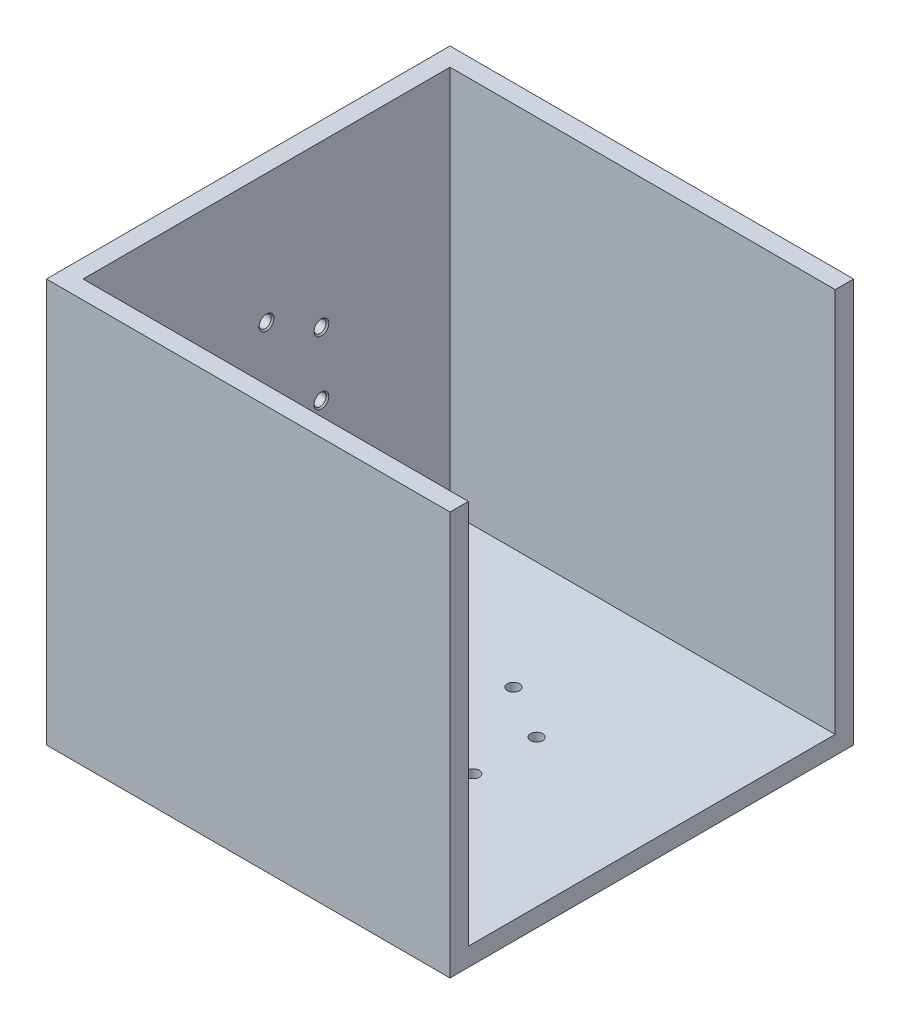
ISO-10303-21;
HEADER;
FILE_DESCRIPTION(('STEP AP214'),'2;1');
FILE_NAME('part.step','',(''),(''),'','','');
FILE_SCHEMA(('AUTOMOTIVE_DESIGN { 1 0 10303 214 1 1 1 1 }'));
ENDSEC;
DATA;
#1=APPLICATION_CONTEXT('core data for automotive mechanical design processes');
#2=APPLICATION_PROTOCOL_DEFINITION('international standard','automotive_design',2000,#1);
#3=PRODUCT_CONTEXT('',#1,'mechanical');
#4=PRODUCT('Part','Part','',(#3));
#5=PRODUCT_RELATED_PRODUCT_CATEGORY('part','',(#4));
#6=PRODUCT_DEFINITION_FORMATION('','',#4);
#7=PRODUCT_DEFINITION_CONTEXT('part definition',#1,'design');
#8=PRODUCT_DEFINITION('design','',#6,#7);
#9=PRODUCT_DEFINITION_SHAPE('','',#8);
#10=(LENGTH_UNIT() NAMED_UNIT(*) SI_UNIT(.MILLI.,.METRE.));
#11=(NAMED_UNIT(*) PLANE_ANGLE_UNIT() SI_UNIT($,.RADIAN.));
#12=(NAMED_UNIT(*) SI_UNIT($,.STERADIAN.) SOLID_ANGLE_UNIT());
#13=UNCERTAINTY_MEASURE_WITH_UNIT(LENGTH_MEASURE(1.E-05),#10,'distance_accuracy_value','');
#14=(GEOMETRIC_REPRESENTATION_CONTEXT(3) GLOBAL_UNCERTAINTY_ASSIGNED_CONTEXT((#13)) GLOBAL_UNIT_ASSIGNED_CONTEXT((#10,
#11,#12)) REPRESENTATION_CONTEXT('',''));
#15=CARTESIAN_POINT('',(0.,0.,0.));
#16=DIRECTION('',(0.,0.,1.));
#17=DIRECTION('',(1.,0.,0.));
#18=AXIS2_PLACEMENT_3D('',#15,#16,#17);
#19=CARTESIAN_POINT('',(55.,110.,-55.));
#20=DIRECTION('',(-1.,0.,0.));
#21=DIRECTION('',(0.,0.,1.));
#22=AXIS2_PLACEMENT_3D('',#19,#20,#21);
#23=PLANE('',#22);
#24=DIRECTION('',(0.,0.,-1.));
#25=VECTOR('',#24,1.);
#26=CARTESIAN_POINT('',(55.,110.,-55.));
#27=LINE('',#26,#25);
#28=CARTESIAN_POINT('',(55.,110.,-50.));
#29=VERTEX_POINT('',#28);
#30=CARTESIAN_POINT('',(55.,110.,-55.));
#31=VERTEX_POINT('',#30);
#32=EDGE_CURVE('E94',#29,#31,#27,.T.);
#33=ORIENTED_EDGE('',*,*,#32,.F.);
#34=DIRECTION('',(0.,-1.,0.));
#35=VECTOR('',#34,1.);
#36=CARTESIAN_POINT('',(55.,110.,-50.));
#37=LINE('',#36,#35);
#38=CARTESIAN_POINT('',(55.,5.,-50.));
#39=VERTEX_POINT('',#38);
#40=EDGE_CURVE('E139',#29,#39,#37,.T.);
#41=ORIENTED_EDGE('',*,*,#40,.T.);
#42=DIRECTION('',(0.,0.,-1.));
#43=VECTOR('',#42,1.);
#44=CARTESIAN_POINT('',(55.,5.,-55.));
#45=LINE('',#44,#43);
#46=CARTESIAN_POINT('',(55.,5.,50.));
#47=VERTEX_POINT('',#46);
#48=EDGE_CURVE('E138',#47,#39,#45,.T.);
#49=ORIENTED_EDGE('',*,*,#48,.F.);
#50=DIRECTION('',(0.,1.,0.));
#51=VECTOR('',#50,1.);
#52=CARTESIAN_POINT('',(55.,110.,50.));
#53=LINE('',#52,#51);
#54=CARTESIAN_POINT('',(55.,110.,50.));
#55=VERTEX_POINT('',#54);
#56=EDGE_CURVE('E125',#47,#55,#53,.T.);
#57=ORIENTED_EDGE('',*,*,#56,.T.);
#58=CARTESIAN_POINT('',(55.,110.,55.));
#59=VERTEX_POINT('',#58);
#60=EDGE_CURVE('E135',#59,#55,#27,.T.);
#61=ORIENTED_EDGE('',*,*,#60,.F.);
#62=DIRECTION('',(0.,-1.,0.));
#63=VECTOR('',#62,1.);
#64=CARTESIAN_POINT('',(55.,110.,55.));
#65=LINE('',#64,#63);
#66=CARTESIAN_POINT('',(55.,0.,55.));
#67=VERTEX_POINT('',#66);
#68=EDGE_CURVE('E152',#59,#67,#65,.T.);
#69=ORIENTED_EDGE('',*,*,#68,.T.);
#70=DIRECTION('',(0.,0.,-1.));
#71=VECTOR('',#70,1.);
#72=CARTESIAN_POINT('',(55.,0.,-55.));
#73=LINE('',#72,#71);
#74=CARTESIAN_POINT('',(55.,0.,-55.));
#75=VERTEX_POINT('',#74);
#76=EDGE_CURVE('E153',#67,#75,#73,.T.);
#77=ORIENTED_EDGE('',*,*,#76,.T.);
#78=DIRECTION('',(0.,-1.,0.));
#79=VECTOR('',#78,1.);
#80=CARTESIAN_POINT('',(55.,110.,-55.));
#81=LINE('',#80,#79);
#82=EDGE_CURVE('E11',#31,#75,#81,.T.);
#83=ORIENTED_EDGE('',*,*,#82,.F.);
#84=EDGE_LOOP('',(#33,#41,#49,#57,#61,#69,#77,#83));
#85=FACE_BOUND('',#84,.T.);
#86=ADVANCED_FACE('F45',(#85),#23,.F.);
#87=CARTESIAN_POINT('',(-55.,110.,-55.));
#88=DIRECTION('',(0.,0.,1.));
#89=DIRECTION('',(1.,0.,0.));
#90=AXIS2_PLACEMENT_3D('',#87,#88,#89);
#91=PLANE('',#90);
#92=DIRECTION('',(-1.,0.,0.));
#93=VECTOR('',#92,1.);
#94=CARTESIAN_POINT('',(-55.,0.,-55.));
#95=LINE('',#94,#93);
#96=CARTESIAN_POINT('',(-55.,0.,-55.));
#97=VERTEX_POINT('',#96);
#98=EDGE_CURVE('E156',#75,#97,#95,.T.);
#99=ORIENTED_EDGE('',*,*,#98,.T.);
#100=DIRECTION('',(0.,-1.,0.));
#101=VECTOR('',#100,1.);
#102=CARTESIAN_POINT('',(-55.,110.,-55.));
#103=LINE('',#102,#101);
#104=CARTESIAN_POINT('',(-55.,110.,-55.));
#105=VERTEX_POINT('',#104);
#106=EDGE_CURVE('E54',#105,#97,#103,.T.);
#107=ORIENTED_EDGE('',*,*,#106,.F.);
#108=DIRECTION('',(-1.,0.,0.));
#109=VECTOR('',#108,1.);
#110=CARTESIAN_POINT('',(-55.,110.,-55.));
#111=LINE('',#110,#109);
#112=EDGE_CURVE('E142',#31,#105,#111,.T.);
#113=ORIENTED_EDGE('',*,*,#112,.F.);
#114=ORIENTED_EDGE('',*,*,#82,.T.);
#115=EDGE_LOOP('',(#99,#107,#113,#114));
#116=FACE_BOUND('',#115,.T.);
#117=ADVANCED_FACE('F234',(#116),#91,.F.);
#118=CARTESIAN_POINT('',(-55.,110.,-55.));
#119=DIRECTION('',(1.,0.,0.));
#120=DIRECTION('',(0.,0.,-1.));
#121=AXIS2_PLACEMENT_3D('',#118,#119,#120);
#122=PLANE('',#121);
#123=CARTESIAN_POINT('',(-55.,66.1144049527634,-14.9572893754042));
#124=DIRECTION('',(1.,0.,0.));
#125=DIRECTION('',(0.,0.,-1.));
#126=AXIS2_PLACEMENT_3D('',#123,#124,#125);
#127=CIRCLE('',#126,1.65);
#128=CARTESIAN_POINT('',(-55.,66.1144049527634,-16.6072893754042));
#129=VERTEX_POINT('',#128);
#130=EDGE_CURVE('E594',#129,#129,#127,.T.);
#131=ORIENTED_EDGE('',*,*,#130,.T.);
#132=EDGE_LOOP('',(#131));
#133=FACE_BOUND('',#132,.T.);
#134=CARTESIAN_POINT('',(-55.,48.8432148582897,-14.9572893754044));
#135=DIRECTION('',(1.,0.,0.));
#136=DIRECTION('',(0.,0.,-1.));
#137=AXIS2_PLACEMENT_3D('',#134,#135,#136);
#138=CIRCLE('',#137,1.65);
#139=CARTESIAN_POINT('',(-55.,48.8432148582897,-16.6072893754043));
#140=VERTEX_POINT('',#139);
#141=EDGE_CURVE('E605',#140,#140,#138,.T.);
#142=ORIENTED_EDGE('',*,*,#141,.T.);
#143=EDGE_LOOP('',(#142));
#144=FACE_BOUND('',#143,.T.);
#145=CARTESIAN_POINT('',(-55.,40.2076198110528,0.));
#146=DIRECTION('',(1.,0.,0.));
#147=DIRECTION('',(0.,0.,-1.));
#148=AXIS2_PLACEMENT_3D('',#145,#146,#147);
#149=CIRCLE('',#148,1.65);
#150=CARTESIAN_POINT('',(-55.,40.2076198110528,-1.64999999999998));
#151=VERTEX_POINT('',#150);
#152=EDGE_CURVE('E614',#151,#151,#149,.T.);
#153=ORIENTED_EDGE('',*,*,#152,.T.);
#154=EDGE_LOOP('',(#153));
#155=FACE_BOUND('',#154,.T.);
#156=CARTESIAN_POINT('',(-55.,48.8432148582895,14.9572893754043));
#157=DIRECTION('',(1.,0.,0.));
#158=DIRECTION('',(0.,0.,-1.));
#159=AXIS2_PLACEMENT_3D('',#156,#157,#158);
#160=CIRCLE('',#159,1.65);
#161=CARTESIAN_POINT('',(-55.,48.8432148582895,13.3072893754043));
#162=VERTEX_POINT('',#161);
#163=EDGE_CURVE('E623',#162,#162,#160,.T.);
#164=ORIENTED_EDGE('',*,*,#163,.T.);
#165=EDGE_LOOP('',(#164));
#166=FACE_BOUND('',#165,.T.);
#167=CARTESIAN_POINT('',(-55.,66.1144049527632,14.9572893754043));
#168=DIRECTION('',(1.,0.,0.));
#169=DIRECTION('',(0.,0.,-1.));
#170=AXIS2_PLACEMENT_3D('',#167,#168,#169);
#171=CIRCLE('',#170,1.65);
#172=CARTESIAN_POINT('',(-55.,66.1144049527632,13.3072893754043));
#173=VERTEX_POINT('',#172);
#174=EDGE_CURVE('E632',#173,#173,#171,.T.);
#175=ORIENTED_EDGE('',*,*,#174,.T.);
#176=EDGE_LOOP('',(#175));
#177=FACE_BOUND('',#176,.T.);
#178=CARTESIAN_POINT('',(-55.,74.75,0.));
#179=DIRECTION('',(1.,0.,0.));
#180=DIRECTION('',(0.,0.,-1.));
#181=AXIS2_PLACEMENT_3D('',#178,#179,#180);
#182=CIRCLE('',#181,1.65);
#183=CARTESIAN_POINT('',(-55.,74.75,-1.64999999999999));
#184=VERTEX_POINT('',#183);
#185=EDGE_CURVE('E641',#184,#184,#182,.T.);
#186=ORIENTED_EDGE('',*,*,#185,.T.);
#187=EDGE_LOOP('',(#186));
#188=FACE_BOUND('',#187,.T.);
#189=DIRECTION('',(0.,0.,1.));
#190=VECTOR('',#189,1.);
#191=CARTESIAN_POINT('',(-55.,0.,-55.));
#192=LINE('',#191,#190);
#193=CARTESIAN_POINT('',(-55.,0.,55.));
#194=VERTEX_POINT('',#193);
#195=EDGE_CURVE('E81',#97,#194,#192,.T.);
#196=ORIENTED_EDGE('',*,*,#195,.T.);
#197=DIRECTION('',(0.,-1.,0.));
#198=VECTOR('',#197,1.);
#199=CARTESIAN_POINT('',(-55.,110.,55.));
#200=LINE('',#199,#198);
#201=CARTESIAN_POINT('',(-55.,110.,55.));
#202=VERTEX_POINT('',#201);
#203=EDGE_CURVE('E161',#202,#194,#200,.T.);
#204=ORIENTED_EDGE('',*,*,#203,.F.);
#205=DIRECTION('',(0.,0.,1.));
#206=VECTOR('',#205,1.);
#207=CARTESIAN_POINT('',(-55.,110.,-55.));
#208=LINE('',#207,#206);
#209=EDGE_CURVE('E144',#105,#202,#208,.T.);
#210=ORIENTED_EDGE('',*,*,#209,.F.);
#211=ORIENTED_EDGE('',*,*,#106,.T.);
#212=EDGE_LOOP('',(#196,#204,#210,#211));
#213=FACE_BOUND('',#212,.T.);
#214=ADVANCED_FACE('F237',(#133,#144,#155,#166,#177,#188,#213),#122,.F.);
#215=CARTESIAN_POINT('',(-55.,110.,55.));
#216=DIRECTION('',(0.,0.,-1.));
#217=DIRECTION('',(-1.,0.,0.));
#218=AXIS2_PLACEMENT_3D('',#215,#216,#217);
#219=PLANE('',#218);
#220=DIRECTION('',(1.,0.,0.));
#221=VECTOR('',#220,1.);
#222=CARTESIAN_POINT('',(-55.,0.,55.));
#223=LINE('',#222,#221);
#224=EDGE_CURVE('E87',#194,#67,#223,.T.);
#225=ORIENTED_EDGE('',*,*,#224,.T.);
#226=ORIENTED_EDGE('',*,*,#68,.F.);
#227=DIRECTION('',(1.,0.,0.));
#228=VECTOR('',#227,1.);
#229=CARTESIAN_POINT('',(-55.,110.,55.));
#230=LINE('',#229,#228);
#231=EDGE_CURVE('E63',#202,#59,#230,.T.);
#232=ORIENTED_EDGE('',*,*,#231,.F.);
#233=ORIENTED_EDGE('',*,*,#203,.T.);
#234=EDGE_LOOP('',(#225,#226,#232,#233));
#235=FACE_BOUND('',#234,.T.);
#236=ADVANCED_FACE('F238',(#235),#219,.F.);
#237=CARTESIAN_POINT('',(0.,110.,0.));
#238=DIRECTION('',(0.,1.,0.));
#239=DIRECTION('',(0.,0.,1.));
#240=AXIS2_PLACEMENT_3D('',#237,#238,#239);
#241=PLANE('',#240);
#242=DIRECTION('',(-1.,0.,0.));
#243=VECTOR('',#242,1.);
#244=CARTESIAN_POINT('',(-50.,110.,-50.));
#245=LINE('',#244,#243);
#246=CARTESIAN_POINT('',(-50.,110.,-50.));
#247=VERTEX_POINT('',#246);
#248=EDGE_CURVE('E215',#29,#247,#245,.T.);
#249=ORIENTED_EDGE('',*,*,#248,.F.);
#250=ORIENTED_EDGE('',*,*,#32,.T.);
#251=ORIENTED_EDGE('',*,*,#112,.T.);
#252=ORIENTED_EDGE('',*,*,#209,.T.);
#253=ORIENTED_EDGE('',*,*,#231,.T.);
#254=ORIENTED_EDGE('',*,*,#60,.T.);
#255=DIRECTION('',(1.,0.,0.));
#256=VECTOR('',#255,1.);
#257=CARTESIAN_POINT('',(-50.,110.,50.));
#258=LINE('',#257,#256);
#259=CARTESIAN_POINT('',(-50.,110.,50.));
#260=VERTEX_POINT('',#259);
#261=EDGE_CURVE('E121',#260,#55,#258,.T.);
#262=ORIENTED_EDGE('',*,*,#261,.F.);
#263=DIRECTION('',(0.,0.,1.));
#264=VECTOR('',#263,1.);
#265=CARTESIAN_POINT('',(-50.,110.,-50.));
#266=LINE('',#265,#264);
#267=EDGE_CURVE('E131',#247,#260,#266,.T.);
#268=ORIENTED_EDGE('',*,*,#267,.F.);
#269=EDGE_LOOP('',(#249,#250,#251,#252,#253,#254,#262,#268));
#270=FACE_BOUND('',#269,.T.);
#271=ADVANCED_FACE('F141',(#270),#241,.T.);
#272=CARTESIAN_POINT('',(0.,0.,0.));
#273=DIRECTION('',(0.,1.,0.));
#274=DIRECTION('',(0.,0.,1.));
#275=AXIS2_PLACEMENT_3D('',#272,#273,#274);
#276=PLANE('',#275);
#277=CARTESIAN_POINT('',(14.9548601894398,0.,8.6158074439338));
#278=DIRECTION('',(0.,-1.,0.));
#279=DIRECTION('',(0.,0.,-1.));
#280=AXIS2_PLACEMENT_3D('',#277,#278,#279);
#281=CIRCLE('',#280,2.025);
#282=CARTESIAN_POINT('',(14.9548601894398,0.,6.5908074439338));
#283=VERTEX_POINT('',#282);
#284=EDGE_CURVE('E644',#283,#283,#281,.T.);
#285=ORIENTED_EDGE('',*,*,#284,.F.);
#286=EDGE_LOOP('',(#285));
#287=FACE_BOUND('',#286,.T.);
#288=CARTESIAN_POINT('',(14.95486018944,0.,-8.65257766819897));
#289=DIRECTION('',(0.,-1.,0.));
#290=DIRECTION('',(0.,0.,-1.));
#291=AXIS2_PLACEMENT_3D('',#288,#289,#290);
#292=CIRCLE('',#291,2.025);
#293=CARTESIAN_POINT('',(14.95486018944,0.,-10.677577668199));
#294=VERTEX_POINT('',#293);
#295=EDGE_CURVE('E191',#294,#294,#292,.T.);
#296=ORIENTED_EDGE('',*,*,#295,.F.);
#297=EDGE_LOOP('',(#296));
#298=FACE_BOUND('',#297,.T.);
#299=CARTESIAN_POINT('',(0.,0.,-17.2867702242655));
#300=DIRECTION('',(0.,-1.,0.));
#301=DIRECTION('',(0.,0.,-1.));
#302=AXIS2_PLACEMENT_3D('',#299,#300,#301);
#303=CIRCLE('',#302,2.025);
#304=CARTESIAN_POINT('',(0.,0.,-19.3117702242655));
#305=VERTEX_POINT('',#304);
#306=EDGE_CURVE('E184',#305,#305,#303,.T.);
#307=ORIENTED_EDGE('',*,*,#306,.F.);
#308=EDGE_LOOP('',(#307));
#309=FACE_BOUND('',#308,.T.);
#310=CARTESIAN_POINT('',(-14.9548601894399,0.,-8.65257766819919));
#311=DIRECTION('',(0.,-1.,0.));
#312=DIRECTION('',(0.,0.,-1.));
#313=AXIS2_PLACEMENT_3D('',#310,#311,#312);
#314=CIRCLE('',#313,2.025);
#315=CARTESIAN_POINT('',(-14.9548601894399,0.,-10.6775776681992));
#316=VERTEX_POINT('',#315);
#317=EDGE_CURVE('E180',#316,#316,#314,.T.);
#318=ORIENTED_EDGE('',*,*,#317,.F.);
#319=EDGE_LOOP('',(#318));
#320=FACE_BOUND('',#319,.T.);
#321=CARTESIAN_POINT('',(-14.95486018944,0.,8.61580744393359));
#322=DIRECTION('',(0.,-1.,0.));
#323=DIRECTION('',(0.,0.,-1.));
#324=AXIS2_PLACEMENT_3D('',#321,#322,#323);
#325=CIRCLE('',#324,2.025);
#326=CARTESIAN_POINT('',(-14.95486018944,0.,6.59080744393359));
#327=VERTEX_POINT('',#326);
#328=EDGE_CURVE('E176',#327,#327,#325,.T.);
#329=ORIENTED_EDGE('',*,*,#328,.F.);
#330=EDGE_LOOP('',(#329));
#331=FACE_BOUND('',#330,.T.);
#332=CARTESIAN_POINT('',(0.,0.,17.25));
#333=DIRECTION('',(0.,-1.,0.));
#334=DIRECTION('',(0.,0.,-1.));
#335=AXIS2_PLACEMENT_3D('',#332,#333,#334);
#336=CIRCLE('',#335,2.025);
#337=CARTESIAN_POINT('',(0.,0.,15.225));
#338=VERTEX_POINT('',#337);
#339=EDGE_CURVE('E171',#338,#338,#336,.T.);
#340=ORIENTED_EDGE('',*,*,#339,.F.);
#341=EDGE_LOOP('',(#340));
#342=FACE_BOUND('',#341,.T.);
#343=ORIENTED_EDGE('',*,*,#76,.F.);
#344=ORIENTED_EDGE('',*,*,#224,.F.);
#345=ORIENTED_EDGE('',*,*,#195,.F.);
#346=ORIENTED_EDGE('',*,*,#98,.F.);
#347=EDGE_LOOP('',(#343,#344,#345,#346));
#348=FACE_BOUND('',#347,.T.);
#349=ADVANCED_FACE('F240',(#287,#298,#309,#320,#331,#342,#348),#276,.F.);
#350=CARTESIAN_POINT('',(-50.,5.,50.));
#351=DIRECTION('',(0.,0.,1.));
#352=DIRECTION('',(1.,0.,0.));
#353=AXIS2_PLACEMENT_3D('',#350,#351,#352);
#354=PLANE('',#353);
#355=ORIENTED_EDGE('',*,*,#261,.T.);
#356=ORIENTED_EDGE('',*,*,#56,.F.);
#357=DIRECTION('',(1.,0.,0.));
#358=VECTOR('',#357,1.);
#359=CARTESIAN_POINT('',(-50.,5.,50.));
#360=LINE('',#359,#358);
#361=CARTESIAN_POINT('',(-50.,5.,50.));
#362=VERTEX_POINT('',#361);
#363=EDGE_CURVE('E221',#362,#47,#360,.T.);
#364=ORIENTED_EDGE('',*,*,#363,.F.);
#365=DIRECTION('',(0.,1.,0.));
#366=VECTOR('',#365,1.);
#367=CARTESIAN_POINT('',(-50.,5.,50.));
#368=LINE('',#367,#366);
#369=EDGE_CURVE('E127',#362,#260,#368,.T.);
#370=ORIENTED_EDGE('',*,*,#369,.T.);
#371=EDGE_LOOP('',(#355,#356,#364,#370));
#372=FACE_BOUND('',#371,.T.);
#373=ADVANCED_FACE('F123',(#372),#354,.F.);
#374=CARTESIAN_POINT('',(-50.,5.,-50.));
#375=DIRECTION('',(-1.,0.,0.));
#376=DIRECTION('',(0.,0.,1.));
#377=AXIS2_PLACEMENT_3D('',#374,#375,#376);
#378=PLANE('',#377);
#379=CARTESIAN_POINT('',(-50.,66.1144049527634,-14.9572893754042));
#380=DIRECTION('',(1.,0.,0.));
#381=DIRECTION('',(0.,0.,-1.));
#382=AXIS2_PLACEMENT_3D('',#379,#380,#381);
#383=CIRCLE('',#382,2.025);
#384=CARTESIAN_POINT('',(-50.,66.1144049527634,-16.9822893754042));
#385=VERTEX_POINT('',#384);
#386=EDGE_CURVE('E592',#385,#385,#383,.T.);
#387=ORIENTED_EDGE('',*,*,#386,.F.);
#388=EDGE_LOOP('',(#387));
#389=FACE_BOUND('',#388,.T.);
#390=CARTESIAN_POINT('',(-50.,48.8432148582897,-14.9572893754044));
#391=DIRECTION('',(1.,0.,0.));
#392=DIRECTION('',(0.,0.,-1.));
#393=AXIS2_PLACEMENT_3D('',#390,#391,#392);
#394=CIRCLE('',#393,2.025);
#395=CARTESIAN_POINT('',(-50.,48.8432148582897,-16.9822893754044));
#396=VERTEX_POINT('',#395);
#397=EDGE_CURVE('E599',#396,#396,#394,.T.);
#398=ORIENTED_EDGE('',*,*,#397,.F.);
#399=EDGE_LOOP('',(#398));
#400=FACE_BOUND('',#399,.T.);
#401=CARTESIAN_POINT('',(-50.,40.2076198110528,0.));
#402=DIRECTION('',(1.,0.,0.));
#403=DIRECTION('',(0.,0.,-1.));
#404=AXIS2_PLACEMENT_3D('',#401,#402,#403);
#405=CIRCLE('',#404,2.025);
#406=CARTESIAN_POINT('',(-50.,40.2076198110528,-2.02499999999999));
#407=VERTEX_POINT('',#406);
#408=EDGE_CURVE('E608',#407,#407,#405,.T.);
#409=ORIENTED_EDGE('',*,*,#408,.F.);
#410=EDGE_LOOP('',(#409));
#411=FACE_BOUND('',#410,.T.);
#412=CARTESIAN_POINT('',(-50.,48.8432148582895,14.9572893754043));
#413=DIRECTION('',(1.,0.,0.));
#414=DIRECTION('',(0.,0.,-1.));
#415=AXIS2_PLACEMENT_3D('',#412,#413,#414);
#416=CIRCLE('',#415,2.025);
#417=CARTESIAN_POINT('',(-50.,48.8432148582895,12.9322893754043));
#418=VERTEX_POINT('',#417);
#419=EDGE_CURVE('E617',#418,#418,#416,.T.);
#420=ORIENTED_EDGE('',*,*,#419,.F.);
#421=EDGE_LOOP('',(#420));
#422=FACE_BOUND('',#421,.T.);
#423=CARTESIAN_POINT('',(-50.,66.1144049527632,14.9572893754043));
#424=DIRECTION('',(1.,0.,0.));
#425=DIRECTION('',(0.,0.,-1.));
#426=AXIS2_PLACEMENT_3D('',#423,#424,#425);
#427=CIRCLE('',#426,2.025);
#428=CARTESIAN_POINT('',(-50.,66.1144049527632,12.9322893754043));
#429=VERTEX_POINT('',#428);
#430=EDGE_CURVE('E626',#429,#429,#427,.T.);
#431=ORIENTED_EDGE('',*,*,#430,.F.);
#432=EDGE_LOOP('',(#431));
#433=FACE_BOUND('',#432,.T.);
#434=CARTESIAN_POINT('',(-50.,74.75,0.));
#435=DIRECTION('',(1.,0.,0.));
#436=DIRECTION('',(0.,0.,-1.));
#437=AXIS2_PLACEMENT_3D('',#434,#435,#436);
#438=CIRCLE('',#437,2.025);
#439=CARTESIAN_POINT('',(-50.,74.75,-2.02499999999999));
#440=VERTEX_POINT('',#439);
#441=EDGE_CURVE('E635',#440,#440,#438,.T.);
#442=ORIENTED_EDGE('',*,*,#441,.F.);
#443=EDGE_LOOP('',(#442));
#444=FACE_BOUND('',#443,.T.);
#445=ORIENTED_EDGE('',*,*,#267,.T.);
#446=ORIENTED_EDGE('',*,*,#369,.F.);
#447=DIRECTION('',(0.,0.,1.));
#448=VECTOR('',#447,1.);
#449=CARTESIAN_POINT('',(-50.,5.,-50.));
#450=LINE('',#449,#448);
#451=CARTESIAN_POINT('',(-50.,5.,-50.));
#452=VERTEX_POINT('',#451);
#453=EDGE_CURVE('E218',#452,#362,#450,.T.);
#454=ORIENTED_EDGE('',*,*,#453,.F.);
#455=DIRECTION('',(0.,1.,0.));
#456=VECTOR('',#455,1.);
#457=CARTESIAN_POINT('',(-50.,5.,-50.));
#458=LINE('',#457,#456);
#459=EDGE_CURVE('E147',#452,#247,#458,.T.);
#460=ORIENTED_EDGE('',*,*,#459,.T.);
#461=EDGE_LOOP('',(#445,#446,#454,#460));
#462=FACE_BOUND('',#461,.T.);
#463=ADVANCED_FACE('F227',(#389,#400,#411,#422,#433,#444,#462),#378,.F.);
#464=CARTESIAN_POINT('',(-50.,5.,-50.));
#465=DIRECTION('',(0.,0.,-1.));
#466=DIRECTION('',(-1.,0.,0.));
#467=AXIS2_PLACEMENT_3D('',#464,#465,#466);
#468=PLANE('',#467);
#469=ORIENTED_EDGE('',*,*,#248,.T.);
#470=ORIENTED_EDGE('',*,*,#459,.F.);
#471=DIRECTION('',(-1.,0.,0.));
#472=VECTOR('',#471,1.);
#473=CARTESIAN_POINT('',(-50.,5.,-50.));
#474=LINE('',#473,#472);
#475=EDGE_CURVE('E130',#39,#452,#474,.T.);
#476=ORIENTED_EDGE('',*,*,#475,.F.);
#477=ORIENTED_EDGE('',*,*,#40,.F.);
#478=EDGE_LOOP('',(#469,#470,#476,#477));
#479=FACE_BOUND('',#478,.T.);
#480=ADVANCED_FACE('F230',(#479),#468,.F.);
#481=CARTESIAN_POINT('',(0.,5.,0.));
#482=DIRECTION('',(0.,1.,0.));
#483=DIRECTION('',(0.,0.,1.));
#484=AXIS2_PLACEMENT_3D('',#481,#482,#483);
#485=PLANE('',#484);
#486=CARTESIAN_POINT('',(14.9548601894398,5.,8.6158074439338));
#487=DIRECTION('',(0.,1.,0.));
#488=DIRECTION('',(0.,0.,1.));
#489=AXIS2_PLACEMENT_3D('',#486,#487,#488);
#490=CIRCLE('',#489,1.64999999999999);
#491=CARTESIAN_POINT('',(14.9548601894398,5.,10.2658074439338));
#492=VERTEX_POINT('',#491);
#493=EDGE_CURVE('E48',#492,#492,#490,.T.);
#494=ORIENTED_EDGE('',*,*,#493,.F.);
#495=EDGE_LOOP('',(#494));
#496=FACE_BOUND('',#495,.T.);
#497=CARTESIAN_POINT('',(14.95486018944,5.,-8.65257766819897));
#498=DIRECTION('',(0.,1.,0.));
#499=DIRECTION('',(0.,0.,1.));
#500=AXIS2_PLACEMENT_3D('',#497,#498,#499);
#501=CIRCLE('',#500,1.64999999999999);
#502=CARTESIAN_POINT('',(14.95486018944,5.,-7.00257766819899));
#503=VERTEX_POINT('',#502);
#504=EDGE_CURVE('E182',#503,#503,#501,.T.);
#505=ORIENTED_EDGE('',*,*,#504,.F.);
#506=EDGE_LOOP('',(#505));
#507=FACE_BOUND('',#506,.T.);
#508=CARTESIAN_POINT('',(0.,5.,-17.2867702242655));
#509=DIRECTION('',(0.,1.,0.));
#510=DIRECTION('',(0.,0.,1.));
#511=AXIS2_PLACEMENT_3D('',#508,#509,#510);
#512=CIRCLE('',#511,1.64999999999999);
#513=CARTESIAN_POINT('',(0.,5.,-15.6367702242655));
#514=VERTEX_POINT('',#513);
#515=EDGE_CURVE('E178',#514,#514,#512,.T.);
#516=ORIENTED_EDGE('',*,*,#515,.F.);
#517=EDGE_LOOP('',(#516));
#518=FACE_BOUND('',#517,.T.);
#519=CARTESIAN_POINT('',(-14.9548601894399,5.,-8.65257766819919));
#520=DIRECTION('',(0.,1.,0.));
#521=DIRECTION('',(0.,0.,1.));
#522=AXIS2_PLACEMENT_3D('',#519,#520,#521);
#523=CIRCLE('',#522,1.64999999999999);
#524=CARTESIAN_POINT('',(-14.9548601894399,5.,-7.0025776681992));
#525=VERTEX_POINT('',#524);
#526=EDGE_CURVE('E173',#525,#525,#523,.T.);
#527=ORIENTED_EDGE('',*,*,#526,.F.);
#528=EDGE_LOOP('',(#527));
#529=FACE_BOUND('',#528,.T.);
#530=CARTESIAN_POINT('',(-14.95486018944,5.,8.61580744393359));
#531=DIRECTION('',(0.,1.,0.));
#532=DIRECTION('',(0.,0.,1.));
#533=AXIS2_PLACEMENT_3D('',#530,#531,#532);
#534=CIRCLE('',#533,1.64999999999999);
#535=CARTESIAN_POINT('',(-14.95486018944,5.,10.2658074439336));
#536=VERTEX_POINT('',#535);
#537=EDGE_CURVE('E168',#536,#536,#534,.T.);
#538=ORIENTED_EDGE('',*,*,#537,.F.);
#539=EDGE_LOOP('',(#538));
#540=FACE_BOUND('',#539,.T.);
#541=CARTESIAN_POINT('',(0.,5.,17.25));
#542=DIRECTION('',(0.,1.,0.));
#543=DIRECTION('',(0.,0.,1.));
#544=AXIS2_PLACEMENT_3D('',#541,#542,#543);
#545=CIRCLE('',#544,1.64999999999999);
#546=CARTESIAN_POINT('',(0.,5.,18.9));
#547=VERTEX_POINT('',#546);
#548=EDGE_CURVE('E164',#547,#547,#545,.T.);
#549=ORIENTED_EDGE('',*,*,#548,.F.);
#550=EDGE_LOOP('',(#549));
#551=FACE_BOUND('',#550,.T.);
#552=ORIENTED_EDGE('',*,*,#363,.T.);
#553=ORIENTED_EDGE('',*,*,#48,.T.);
#554=ORIENTED_EDGE('',*,*,#475,.T.);
#555=ORIENTED_EDGE('',*,*,#453,.T.);
#556=EDGE_LOOP('',(#552,#553,#554,#555));
#557=FACE_BOUND('',#556,.T.);
#558=ADVANCED_FACE('F310',(#496,#507,#518,#529,#540,#551,#557),#485,.T.);
#559=CARTESIAN_POINT('',(0.,0.,17.25));
#560=DIRECTION('',(0.,-1.,0.));
#561=DIRECTION('',(0.,0.,-1.));
#562=AXIS2_PLACEMENT_3D('',#559,#560,#561);
#563=CYLINDRICAL_SURFACE('',#562,1.64999999999999);
#564=ORIENTED_EDGE('',*,*,#548,.T.);
#565=EDGE_LOOP('',(#564));
#566=FACE_BOUND('',#565,.T.);
#567=CARTESIAN_POINT('',(0.,0.375,17.25));
#568=DIRECTION('',(0.,-1.,0.));
#569=DIRECTION('',(0.,0.,-1.));
#570=AXIS2_PLACEMENT_3D('',#567,#568,#569);
#571=CIRCLE('',#570,1.64999999999999);
#572=CARTESIAN_POINT('',(0.,0.375,15.6));
#573=VERTEX_POINT('',#572);
#574=EDGE_CURVE('E167',#573,#573,#571,.T.);
#575=ORIENTED_EDGE('',*,*,#574,.T.);
#576=EDGE_LOOP('',(#575));
#577=FACE_BOUND('',#576,.T.);
#578=ADVANCED_FACE('F319',(#566,#577),#563,.F.);
#579=CARTESIAN_POINT('',(0.,0.,17.25));
#580=DIRECTION('',(0.,-1.,0.));
#581=DIRECTION('',(0.,0.,-1.));
#582=AXIS2_PLACEMENT_3D('',#579,#580,#581);
#583=CONICAL_SURFACE('',#582,2.025,0.78539816339746);
#584=ORIENTED_EDGE('',*,*,#574,.F.);
#585=EDGE_LOOP('',(#584));
#586=FACE_BOUND('',#585,.T.);
#587=ORIENTED_EDGE('',*,*,#339,.T.);
#588=EDGE_LOOP('',(#587));
#589=FACE_BOUND('',#588,.T.);
#590=ADVANCED_FACE('F334',(#586,#589),#583,.F.);
#591=CARTESIAN_POINT('',(-14.95486018944,0.,8.61580744393359));
#592=DIRECTION('',(0.,-1.,0.));
#593=DIRECTION('',(0.,0.,-1.));
#594=AXIS2_PLACEMENT_3D('',#591,#592,#593);
#595=CYLINDRICAL_SURFACE('',#594,1.64999999999999);
#596=ORIENTED_EDGE('',*,*,#537,.T.);
#597=EDGE_LOOP('',(#596));
#598=FACE_BOUND('',#597,.T.);
#599=CARTESIAN_POINT('',(-14.95486018944,0.375,8.61580744393359));
#600=DIRECTION('',(0.,-1.,0.));
#601=DIRECTION('',(0.,0.,-1.));
#602=AXIS2_PLACEMENT_3D('',#599,#600,#601);
#603=CIRCLE('',#602,1.64999999999999);
#604=CARTESIAN_POINT('',(-14.95486018944,0.375,6.9658074439336));
#605=VERTEX_POINT('',#604);
#606=EDGE_CURVE('E172',#605,#605,#603,.T.);
#607=ORIENTED_EDGE('',*,*,#606,.T.);
#608=EDGE_LOOP('',(#607));
#609=FACE_BOUND('',#608,.T.);
#610=ADVANCED_FACE('F344',(#598,#609),#595,.F.);
#611=CARTESIAN_POINT('',(-14.95486018944,0.,8.61580744393359));
#612=DIRECTION('',(0.,-1.,0.));
#613=DIRECTION('',(0.,0.,-1.));
#614=AXIS2_PLACEMENT_3D('',#611,#612,#613);
#615=CONICAL_SURFACE('',#614,2.025,0.78539816339746);
#616=ORIENTED_EDGE('',*,*,#606,.F.);
#617=EDGE_LOOP('',(#616));
#618=FACE_BOUND('',#617,.T.);
#619=ORIENTED_EDGE('',*,*,#328,.T.);
#620=EDGE_LOOP('',(#619));
#621=FACE_BOUND('',#620,.T.);
#622=ADVANCED_FACE('F354',(#618,#621),#615,.F.);
#623=CARTESIAN_POINT('',(-14.9548601894399,0.,-8.65257766819919));
#624=DIRECTION('',(0.,-1.,0.));
#625=DIRECTION('',(0.,0.,-1.));
#626=AXIS2_PLACEMENT_3D('',#623,#624,#625);
#627=CYLINDRICAL_SURFACE('',#626,1.64999999999999);
#628=ORIENTED_EDGE('',*,*,#526,.T.);
#629=EDGE_LOOP('',(#628));
#630=FACE_BOUND('',#629,.T.);
#631=CARTESIAN_POINT('',(-14.9548601894399,0.375,-8.65257766819919));
#632=DIRECTION('',(0.,-1.,0.));
#633=DIRECTION('',(0.,0.,-1.));
#634=AXIS2_PLACEMENT_3D('',#631,#632,#633);
#635=CIRCLE('',#634,1.64999999999999);
#636=CARTESIAN_POINT('',(-14.9548601894399,0.375,-10.3025776681992));
#637=VERTEX_POINT('',#636);
#638=EDGE_CURVE('E177',#637,#637,#635,.T.);
#639=ORIENTED_EDGE('',*,*,#638,.T.);
#640=EDGE_LOOP('',(#639));
#641=FACE_BOUND('',#640,.T.);
#642=ADVANCED_FACE('F365',(#630,#641),#627,.F.);
#643=CARTESIAN_POINT('',(-14.9548601894399,0.,-8.65257766819919));
#644=DIRECTION('',(0.,-1.,0.));
#645=DIRECTION('',(0.,0.,-1.));
#646=AXIS2_PLACEMENT_3D('',#643,#644,#645);
#647=CONICAL_SURFACE('',#646,2.025,0.78539816339746);
#648=ORIENTED_EDGE('',*,*,#638,.F.);
#649=EDGE_LOOP('',(#648));
#650=FACE_BOUND('',#649,.T.);
#651=ORIENTED_EDGE('',*,*,#317,.T.);
#652=EDGE_LOOP('',(#651));
#653=FACE_BOUND('',#652,.T.);
#654=ADVANCED_FACE('F376',(#650,#653),#647,.F.);
#655=CARTESIAN_POINT('',(0.,0.,-17.2867702242655));
#656=DIRECTION('',(0.,-1.,0.));
#657=DIRECTION('',(0.,0.,-1.));
#658=AXIS2_PLACEMENT_3D('',#655,#656,#657);
#659=CYLINDRICAL_SURFACE('',#658,1.64999999999999);
#660=ORIENTED_EDGE('',*,*,#515,.T.);
#661=EDGE_LOOP('',(#660));
#662=FACE_BOUND('',#661,.T.);
#663=CARTESIAN_POINT('',(0.,0.375,-17.2867702242655));
#664=DIRECTION('',(0.,-1.,0.));
#665=DIRECTION('',(0.,0.,-1.));
#666=AXIS2_PLACEMENT_3D('',#663,#664,#665);
#667=CIRCLE('',#666,1.64999999999999);
#668=CARTESIAN_POINT('',(0.,0.375,-18.9367702242655));
#669=VERTEX_POINT('',#668);
#670=EDGE_CURVE('E181',#669,#669,#667,.T.);
#671=ORIENTED_EDGE('',*,*,#670,.T.);
#672=EDGE_LOOP('',(#671));
#673=FACE_BOUND('',#672,.T.);
#674=ADVANCED_FACE('F387',(#662,#673),#659,.F.);
#675=CARTESIAN_POINT('',(0.,0.,-17.2867702242655));
#676=DIRECTION('',(0.,-1.,0.));
#677=DIRECTION('',(0.,0.,-1.));
#678=AXIS2_PLACEMENT_3D('',#675,#676,#677);
#679=CONICAL_SURFACE('',#678,2.025,0.78539816339746);
#680=ORIENTED_EDGE('',*,*,#670,.F.);
#681=EDGE_LOOP('',(#680));
#682=FACE_BOUND('',#681,.T.);
#683=ORIENTED_EDGE('',*,*,#306,.T.);
#684=EDGE_LOOP('',(#683));
#685=FACE_BOUND('',#684,.T.);
#686=ADVANCED_FACE('F398',(#682,#685),#679,.F.);
#687=CARTESIAN_POINT('',(14.95486018944,0.,-8.65257766819897));
#688=DIRECTION('',(0.,-1.,0.));
#689=DIRECTION('',(0.,0.,-1.));
#690=AXIS2_PLACEMENT_3D('',#687,#688,#689);
#691=CYLINDRICAL_SURFACE('',#690,1.64999999999999);
#692=ORIENTED_EDGE('',*,*,#504,.T.);
#693=EDGE_LOOP('',(#692));
#694=FACE_BOUND('',#693,.T.);
#695=CARTESIAN_POINT('',(14.95486018944,0.375,-8.65257766819897));
#696=DIRECTION('',(0.,-1.,0.));
#697=DIRECTION('',(0.,0.,-1.));
#698=AXIS2_PLACEMENT_3D('',#695,#696,#697);
#699=CIRCLE('',#698,1.64999999999999);
#700=CARTESIAN_POINT('',(14.95486018944,0.375,-10.302577668199));
#701=VERTEX_POINT('',#700);
#702=EDGE_CURVE('E185',#701,#701,#699,.T.);
#703=ORIENTED_EDGE('',*,*,#702,.T.);
#704=EDGE_LOOP('',(#703));
#705=FACE_BOUND('',#704,.T.);
#706=ADVANCED_FACE('F409',(#694,#705),#691,.F.);
#707=CARTESIAN_POINT('',(14.95486018944,0.,-8.65257766819897));
#708=DIRECTION('',(0.,-1.,0.));
#709=DIRECTION('',(0.,0.,-1.));
#710=AXIS2_PLACEMENT_3D('',#707,#708,#709);
#711=CONICAL_SURFACE('',#710,2.025,0.78539816339746);
#712=ORIENTED_EDGE('',*,*,#702,.F.);
#713=EDGE_LOOP('',(#712));
#714=FACE_BOUND('',#713,.T.);
#715=ORIENTED_EDGE('',*,*,#295,.T.);
#716=EDGE_LOOP('',(#715));
#717=FACE_BOUND('',#716,.T.);
#718=ADVANCED_FACE('F420',(#714,#717),#711,.F.);
#719=CARTESIAN_POINT('',(14.9548601894398,0.,8.6158074439338));
#720=DIRECTION('',(0.,-1.,0.));
#721=DIRECTION('',(0.,0.,-1.));
#722=AXIS2_PLACEMENT_3D('',#719,#720,#721);
#723=CYLINDRICAL_SURFACE('',#722,1.64999999999999);
#724=ORIENTED_EDGE('',*,*,#493,.T.);
#725=EDGE_LOOP('',(#724));
#726=FACE_BOUND('',#725,.T.);
#727=CARTESIAN_POINT('',(14.9548601894398,0.375,8.6158074439338));
#728=DIRECTION('',(0.,-1.,0.));
#729=DIRECTION('',(0.,0.,-1.));
#730=AXIS2_PLACEMENT_3D('',#727,#728,#729);
#731=CIRCLE('',#730,1.64999999999999);
#732=CARTESIAN_POINT('',(14.9548601894398,0.375,6.96580744393381));
#733=VERTEX_POINT('',#732);
#734=EDGE_CURVE('E646',#733,#733,#731,.T.);
#735=ORIENTED_EDGE('',*,*,#734,.T.);
#736=EDGE_LOOP('',(#735));
#737=FACE_BOUND('',#736,.T.);
#738=ADVANCED_FACE('F430',(#726,#737),#723,.F.);
#739=CARTESIAN_POINT('',(14.9548601894398,0.,8.6158074439338));
#740=DIRECTION('',(0.,-1.,0.));
#741=DIRECTION('',(0.,0.,-1.));
#742=AXIS2_PLACEMENT_3D('',#739,#740,#741);
#743=CONICAL_SURFACE('',#742,2.025,0.78539816339746);
#744=ORIENTED_EDGE('',*,*,#734,.F.);
#745=EDGE_LOOP('',(#744));
#746=FACE_BOUND('',#745,.T.);
#747=ORIENTED_EDGE('',*,*,#284,.T.);
#748=EDGE_LOOP('',(#747));
#749=FACE_BOUND('',#748,.T.);
#750=ADVANCED_FACE('F441',(#746,#749),#743,.F.);
#751=CARTESIAN_POINT('',(-50.,74.75,0.));
#752=DIRECTION('',(1.,0.,0.));
#753=DIRECTION('',(0.,0.,-1.));
#754=AXIS2_PLACEMENT_3D('',#751,#752,#753);
#755=CYLINDRICAL_SURFACE('',#754,1.64999999999999);
#756=ORIENTED_EDGE('',*,*,#185,.F.);
#757=EDGE_LOOP('',(#756));
#758=FACE_BOUND('',#757,.T.);
#759=CARTESIAN_POINT('',(-50.375,74.75,0.));
#760=DIRECTION('',(1.,0.,0.));
#761=DIRECTION('',(0.,0.,-1.));
#762=AXIS2_PLACEMENT_3D('',#759,#760,#761);
#763=CIRCLE('',#762,1.64999999999998);
#764=CARTESIAN_POINT('',(-50.375,74.75,-1.64999999999998));
#765=VERTEX_POINT('',#764);
#766=EDGE_CURVE('E638',#765,#765,#763,.T.);
#767=ORIENTED_EDGE('',*,*,#766,.T.);
#768=EDGE_LOOP('',(#767));
#769=FACE_BOUND('',#768,.T.);
#770=ADVANCED_FACE('F452',(#758,#769),#755,.F.);
#771=CARTESIAN_POINT('',(-50.,74.75,0.));
#772=DIRECTION('',(1.,0.,0.));
#773=DIRECTION('',(0.,0.,-1.));
#774=AXIS2_PLACEMENT_3D('',#771,#772,#773);
#775=CONICAL_SURFACE('',#774,2.025,0.785398163397467);
#776=ORIENTED_EDGE('',*,*,#766,.F.);
#777=EDGE_LOOP('',(#776));
#778=FACE_BOUND('',#777,.T.);
#779=ORIENTED_EDGE('',*,*,#441,.T.);
#780=EDGE_LOOP('',(#779));
#781=FACE_BOUND('',#780,.T.);
#782=ADVANCED_FACE('F463',(#778,#781),#775,.F.);
#783=CARTESIAN_POINT('',(-50.,66.1144049527632,14.9572893754043));
#784=DIRECTION('',(1.,0.,0.));
#785=DIRECTION('',(0.,0.,-1.));
#786=AXIS2_PLACEMENT_3D('',#783,#784,#785);
#787=CYLINDRICAL_SURFACE('',#786,1.64999999999999);
#788=ORIENTED_EDGE('',*,*,#174,.F.);
#789=EDGE_LOOP('',(#788));
#790=FACE_BOUND('',#789,.T.);
#791=CARTESIAN_POINT('',(-50.375,66.1144049527632,14.9572893754043));
#792=DIRECTION('',(1.,0.,0.));
#793=DIRECTION('',(0.,0.,-1.));
#794=AXIS2_PLACEMENT_3D('',#791,#792,#793);
#795=CIRCLE('',#794,1.64999999999998);
#796=CARTESIAN_POINT('',(-50.375,66.1144049527632,13.3072893754043));
#797=VERTEX_POINT('',#796);
#798=EDGE_CURVE('E629',#797,#797,#795,.T.);
#799=ORIENTED_EDGE('',*,*,#798,.T.);
#800=EDGE_LOOP('',(#799));
#801=FACE_BOUND('',#800,.T.);
#802=ADVANCED_FACE('F474',(#790,#801),#787,.F.);
#803=CARTESIAN_POINT('',(-50.,66.1144049527632,14.9572893754043));
#804=DIRECTION('',(1.,0.,0.));
#805=DIRECTION('',(0.,0.,-1.));
#806=AXIS2_PLACEMENT_3D('',#803,#804,#805);
#807=CONICAL_SURFACE('',#806,2.025,0.785398163397467);
#808=ORIENTED_EDGE('',*,*,#798,.F.);
#809=EDGE_LOOP('',(#808));
#810=FACE_BOUND('',#809,.T.);
#811=ORIENTED_EDGE('',*,*,#430,.T.);
#812=EDGE_LOOP('',(#811));
#813=FACE_BOUND('',#812,.T.);
#814=ADVANCED_FACE('F484',(#810,#813),#807,.F.);
#815=CARTESIAN_POINT('',(-50.,48.8432148582895,14.9572893754043));
#816=DIRECTION('',(1.,0.,0.));
#817=DIRECTION('',(0.,0.,-1.));
#818=AXIS2_PLACEMENT_3D('',#815,#816,#817);
#819=CYLINDRICAL_SURFACE('',#818,1.64999999999999);
#820=ORIENTED_EDGE('',*,*,#163,.F.);
#821=EDGE_LOOP('',(#820));
#822=FACE_BOUND('',#821,.T.);
#823=CARTESIAN_POINT('',(-50.375,48.8432148582895,14.9572893754043));
#824=DIRECTION('',(1.,0.,0.));
#825=DIRECTION('',(0.,0.,-1.));
#826=AXIS2_PLACEMENT_3D('',#823,#824,#825);
#827=CIRCLE('',#826,1.64999999999998);
#828=CARTESIAN_POINT('',(-50.375,48.8432148582895,13.3072893754043));
#829=VERTEX_POINT('',#828);
#830=EDGE_CURVE('E620',#829,#829,#827,.T.);
#831=ORIENTED_EDGE('',*,*,#830,.T.);
#832=EDGE_LOOP('',(#831));
#833=FACE_BOUND('',#832,.T.);
#834=ADVANCED_FACE('F495',(#822,#833),#819,.F.);
#835=CARTESIAN_POINT('',(-50.,48.8432148582895,14.9572893754043));
#836=DIRECTION('',(1.,0.,0.));
#837=DIRECTION('',(0.,0.,-1.));
#838=AXIS2_PLACEMENT_3D('',#835,#836,#837);
#839=CONICAL_SURFACE('',#838,2.025,0.785398163397467);
#840=ORIENTED_EDGE('',*,*,#830,.F.);
#841=EDGE_LOOP('',(#840));
#842=FACE_BOUND('',#841,.T.);
#843=ORIENTED_EDGE('',*,*,#419,.T.);
#844=EDGE_LOOP('',(#843));
#845=FACE_BOUND('',#844,.T.);
#846=ADVANCED_FACE('F506',(#842,#845),#839,.F.);
#847=CARTESIAN_POINT('',(-50.,40.2076198110528,0.));
#848=DIRECTION('',(1.,0.,0.));
#849=DIRECTION('',(0.,0.,-1.));
#850=AXIS2_PLACEMENT_3D('',#847,#848,#849);
#851=CYLINDRICAL_SURFACE('',#850,1.64999999999999);
#852=ORIENTED_EDGE('',*,*,#152,.F.);
#853=EDGE_LOOP('',(#852));
#854=FACE_BOUND('',#853,.T.);
#855=CARTESIAN_POINT('',(-50.375,40.2076198110528,0.));
#856=DIRECTION('',(1.,0.,0.));
#857=DIRECTION('',(0.,0.,-1.));
#858=AXIS2_PLACEMENT_3D('',#855,#856,#857);
#859=CIRCLE('',#858,1.64999999999998);
#860=CARTESIAN_POINT('',(-50.375,40.2076198110528,-1.64999999999997));
#861=VERTEX_POINT('',#860);
#862=EDGE_CURVE('E611',#861,#861,#859,.T.);
#863=ORIENTED_EDGE('',*,*,#862,.T.);
#864=EDGE_LOOP('',(#863));
#865=FACE_BOUND('',#864,.T.);
#866=ADVANCED_FACE('F517',(#854,#865),#851,.F.);
#867=CARTESIAN_POINT('',(-50.,40.2076198110528,0.));
#868=DIRECTION('',(1.,0.,0.));
#869=DIRECTION('',(0.,0.,-1.));
#870=AXIS2_PLACEMENT_3D('',#867,#868,#869);
#871=CONICAL_SURFACE('',#870,2.025,0.785398163397467);
#872=ORIENTED_EDGE('',*,*,#862,.F.);
#873=EDGE_LOOP('',(#872));
#874=FACE_BOUND('',#873,.T.);
#875=ORIENTED_EDGE('',*,*,#408,.T.);
#876=EDGE_LOOP('',(#875));
#877=FACE_BOUND('',#876,.T.);
#878=ADVANCED_FACE('F528',(#874,#877),#871,.F.);
#879=CARTESIAN_POINT('',(-50.,48.8432148582897,-14.9572893754044));
#880=DIRECTION('',(1.,0.,0.));
#881=DIRECTION('',(0.,0.,-1.));
#882=AXIS2_PLACEMENT_3D('',#879,#880,#881);
#883=CYLINDRICAL_SURFACE('',#882,1.65);
#884=ORIENTED_EDGE('',*,*,#141,.F.);
#885=EDGE_LOOP('',(#884));
#886=FACE_BOUND('',#885,.T.);
#887=CARTESIAN_POINT('',(-50.375,48.8432148582897,-14.9572893754044));
#888=DIRECTION('',(1.,0.,0.));
#889=DIRECTION('',(0.,0.,-1.));
#890=AXIS2_PLACEMENT_3D('',#887,#888,#889);
#891=CIRCLE('',#890,1.64999999999999);
#892=CARTESIAN_POINT('',(-50.375,48.8432148582897,-16.6072893754043));
#893=VERTEX_POINT('',#892);
#894=EDGE_CURVE('E602',#893,#893,#891,.T.);
#895=ORIENTED_EDGE('',*,*,#894,.T.);
#896=EDGE_LOOP('',(#895));
#897=FACE_BOUND('',#896,.T.);
#898=ADVANCED_FACE('F539',(#886,#897),#883,.F.);
#899=CARTESIAN_POINT('',(-50.,48.8432148582897,-14.9572893754044));
#900=DIRECTION('',(1.,0.,0.));
#901=DIRECTION('',(0.,0.,-1.));
#902=AXIS2_PLACEMENT_3D('',#899,#900,#901);
#903=CONICAL_SURFACE('',#902,2.025,0.785398163397458);
#904=ORIENTED_EDGE('',*,*,#894,.F.);
#905=EDGE_LOOP('',(#904));
#906=FACE_BOUND('',#905,.T.);
#907=ORIENTED_EDGE('',*,*,#397,.T.);
#908=EDGE_LOOP('',(#907));
#909=FACE_BOUND('',#908,.T.);
#910=ADVANCED_FACE('F550',(#906,#909),#903,.F.);
#911=CARTESIAN_POINT('',(-50.,66.1144049527634,-14.9572893754042));
#912=DIRECTION('',(1.,0.,0.));
#913=DIRECTION('',(0.,0.,-1.));
#914=AXIS2_PLACEMENT_3D('',#911,#912,#913);
#915=CYLINDRICAL_SURFACE('',#914,1.64999999999999);
#916=ORIENTED_EDGE('',*,*,#130,.F.);
#917=EDGE_LOOP('',(#916));
#918=FACE_BOUND('',#917,.T.);
#919=CARTESIAN_POINT('',(-50.375,66.1144049527634,-14.9572893754042));
#920=DIRECTION('',(1.,0.,0.));
#921=DIRECTION('',(0.,0.,-1.));
#922=AXIS2_PLACEMENT_3D('',#919,#920,#921);
#923=CIRCLE('',#922,1.64999999999998);
#924=CARTESIAN_POINT('',(-50.375,66.1144049527634,-16.6072893754042));
#925=VERTEX_POINT('',#924);
#926=EDGE_CURVE('E589',#925,#925,#923,.T.);
#927=ORIENTED_EDGE('',*,*,#926,.T.);
#928=EDGE_LOOP('',(#927));
#929=FACE_BOUND('',#928,.T.);
#930=ADVANCED_FACE('F561',(#918,#929),#915,.F.);
#931=CARTESIAN_POINT('',(-50.,66.1144049527634,-14.9572893754042));
#932=DIRECTION('',(1.,0.,0.));
#933=DIRECTION('',(0.,0.,-1.));
#934=AXIS2_PLACEMENT_3D('',#931,#932,#933);
#935=CONICAL_SURFACE('',#934,2.025,0.785398163397467);
#936=ORIENTED_EDGE('',*,*,#926,.F.);
#937=EDGE_LOOP('',(#936));
#938=FACE_BOUND('',#937,.T.);
#939=ORIENTED_EDGE('',*,*,#386,.T.);
#940=EDGE_LOOP('',(#939));
#941=FACE_BOUND('',#940,.T.);
#942=ADVANCED_FACE('F572',(#938,#941),#935,.F.);
#943=CLOSED_SHELL('',(#86,#117,#214,#236,#271,#349,#373,#463,#480,#558,#578,#590,#610,#622,#642,
#654,#674,#686,#706,#718,#738,#750,#770,#782,#802,#814,#834,#846,#866,#878,#898,#910,#930,#942));
#944=MANIFOLD_SOLID_BREP('B2',#943);
#945=ADVANCED_BREP_SHAPE_REPRESENTATION('',(#18,#944),#14);
#946=SHAPE_DEFINITION_REPRESENTATION(#9,#945);
ENDSEC;
END-ISO-10303-21;
